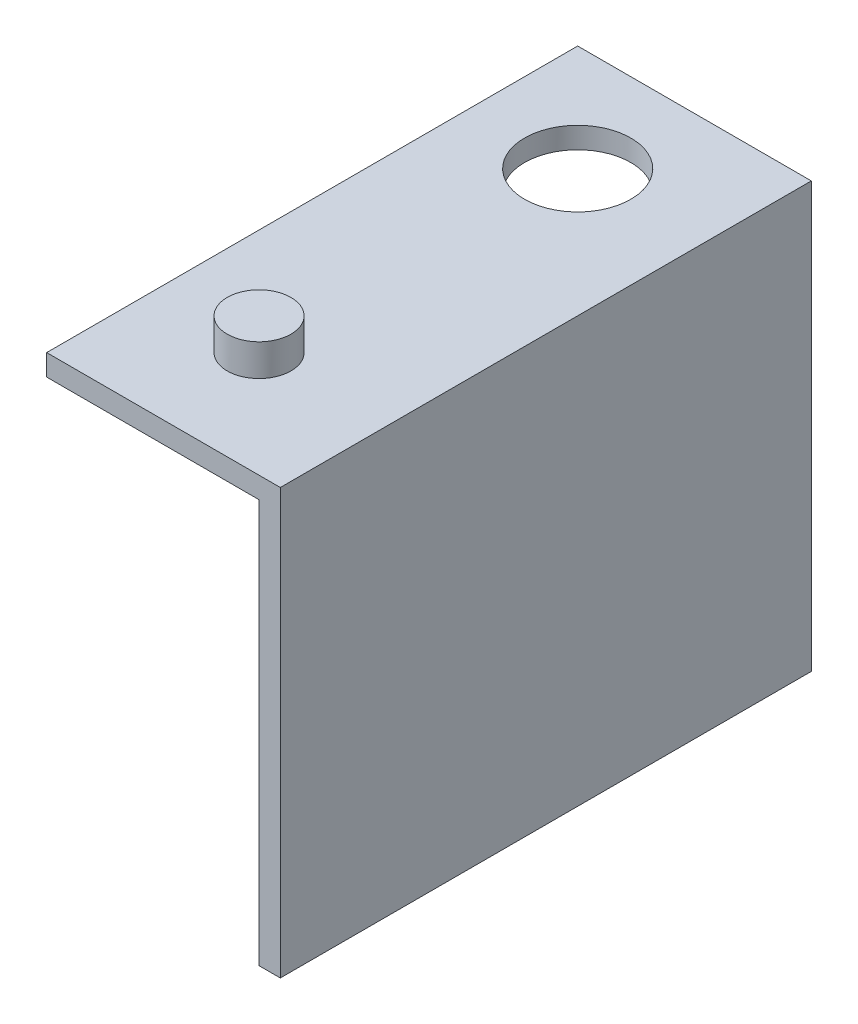
ISO-10303-21;
HEADER;
FILE_DESCRIPTION(('STEP AP214'),'2;1');
FILE_NAME('part.step','',(''),(''),'','','');
FILE_SCHEMA(('AUTOMOTIVE_DESIGN { 1 0 10303 214 1 1 1 1 }'));
ENDSEC;
DATA;
#1=APPLICATION_CONTEXT('core data for automotive mechanical design processes');
#2=APPLICATION_PROTOCOL_DEFINITION('international standard','automotive_design',2000,#1);
#3=PRODUCT_CONTEXT('',#1,'mechanical');
#4=PRODUCT('Part','Part','',(#3));
#5=PRODUCT_RELATED_PRODUCT_CATEGORY('part','',(#4));
#6=PRODUCT_DEFINITION_FORMATION('','',#4);
#7=PRODUCT_DEFINITION_CONTEXT('part definition',#1,'design');
#8=PRODUCT_DEFINITION('design','',#6,#7);
#9=PRODUCT_DEFINITION_SHAPE('','',#8);
#10=(LENGTH_UNIT() NAMED_UNIT(*) SI_UNIT(.MILLI.,.METRE.));
#11=(NAMED_UNIT(*) PLANE_ANGLE_UNIT() SI_UNIT($,.RADIAN.));
#12=(NAMED_UNIT(*) SI_UNIT($,.STERADIAN.) SOLID_ANGLE_UNIT());
#13=UNCERTAINTY_MEASURE_WITH_UNIT(LENGTH_MEASURE(1.E-05),#10,'distance_accuracy_value','');
#14=(GEOMETRIC_REPRESENTATION_CONTEXT(3) GLOBAL_UNCERTAINTY_ASSIGNED_CONTEXT((#13)) GLOBAL_UNIT_ASSIGNED_CONTEXT((#10,
#11,#12)) REPRESENTATION_CONTEXT('',''));
#15=CARTESIAN_POINT('',(0.,0.,0.));
#16=DIRECTION('',(0.,0.,1.));
#17=DIRECTION('',(1.,0.,0.));
#18=AXIS2_PLACEMENT_3D('',#15,#16,#17);
#19=CARTESIAN_POINT('',(20.,0.,50.));
#20=DIRECTION('',(0.,1.,0.));
#21=DIRECTION('',(-1.,0.,0.));
#22=AXIS2_PLACEMENT_3D('',#19,#20,#21);
#23=PLANE('',#22);
#24=CARTESIAN_POINT('',(10.,0.,10.));
#25=DIRECTION('',(0.,1.,0.));
#26=DIRECTION('',(-1.,0.,0.));
#27=AXIS2_PLACEMENT_3D('',#24,#25,#26);
#28=CIRCLE('',#27,5.);
#29=CARTESIAN_POINT('',(5.,0.,10.));
#30=VERTEX_POINT('',#29);
#31=EDGE_CURVE('E134',#30,#30,#28,.F.);
#32=ORIENTED_EDGE('',*,*,#31,.F.);
#33=EDGE_LOOP('',(#32));
#34=FACE_BOUND('',#33,.T.);
#35=DIRECTION('',(1.,0.,0.));
#36=VECTOR('',#35,1.);
#37=CARTESIAN_POINT('',(20.,0.,0.));
#38=LINE('',#37,#36);
#39=CARTESIAN_POINT('',(0.,0.,0.));
#40=VERTEX_POINT('',#39);
#41=CARTESIAN_POINT('',(20.,0.,0.));
#42=VERTEX_POINT('',#41);
#43=EDGE_CURVE('E129',#40,#42,#38,.T.);
#44=ORIENTED_EDGE('',*,*,#43,.T.);
#45=DIRECTION('',(0.,0.,-1.));
#46=VECTOR('',#45,1.);
#47=CARTESIAN_POINT('',(20.,0.,50.));
#48=LINE('',#47,#46);
#49=CARTESIAN_POINT('',(20.,0.,50.));
#50=VERTEX_POINT('',#49);
#51=EDGE_CURVE('E48',#50,#42,#48,.T.);
#52=ORIENTED_EDGE('',*,*,#51,.F.);
#53=DIRECTION('',(1.,0.,0.));
#54=VECTOR('',#53,1.);
#55=CARTESIAN_POINT('',(20.,0.,50.));
#56=LINE('',#55,#54);
#57=CARTESIAN_POINT('',(0.,0.,50.));
#58=VERTEX_POINT('',#57);
#59=EDGE_CURVE('E146',#58,#50,#56,.T.);
#60=ORIENTED_EDGE('',*,*,#59,.F.);
#61=DIRECTION('',(0.,0.,-1.));
#62=VECTOR('',#61,1.);
#63=CARTESIAN_POINT('',(0.,0.,50.));
#64=LINE('',#63,#62);
#65=EDGE_CURVE('E125',#58,#40,#64,.T.);
#66=ORIENTED_EDGE('',*,*,#65,.T.);
#67=EDGE_LOOP('',(#44,#52,#60,#66));
#68=FACE_BOUND('',#67,.T.);
#69=ADVANCED_FACE('F39',(#34,#68),#23,.F.);
#70=CARTESIAN_POINT('',(20.,-38.,50.));
#71=DIRECTION('',(1.,0.,0.));
#72=DIRECTION('',(0.,0.,-1.));
#73=AXIS2_PLACEMENT_3D('',#70,#71,#72);
#74=PLANE('',#73);
#75=DIRECTION('',(0.,-1.,0.));
#76=VECTOR('',#75,1.);
#77=CARTESIAN_POINT('',(20.,-38.,0.));
#78=LINE('',#77,#76);
#79=CARTESIAN_POINT('',(20.,-38.,0.));
#80=VERTEX_POINT('',#79);
#81=EDGE_CURVE('E133',#42,#80,#78,.T.);
#82=ORIENTED_EDGE('',*,*,#81,.T.);
#83=DIRECTION('',(0.,0.,-1.));
#84=VECTOR('',#83,1.);
#85=CARTESIAN_POINT('',(20.,-38.,50.));
#86=LINE('',#85,#84);
#87=CARTESIAN_POINT('',(20.,-38.,50.));
#88=VERTEX_POINT('',#87);
#89=EDGE_CURVE('E153',#88,#80,#86,.T.);
#90=ORIENTED_EDGE('',*,*,#89,.F.);
#91=DIRECTION('',(0.,-1.,0.));
#92=VECTOR('',#91,1.);
#93=CARTESIAN_POINT('',(20.,-38.,50.));
#94=LINE('',#93,#92);
#95=EDGE_CURVE('E94',#50,#88,#94,.T.);
#96=ORIENTED_EDGE('',*,*,#95,.F.);
#97=ORIENTED_EDGE('',*,*,#51,.T.);
#98=EDGE_LOOP('',(#82,#90,#96,#97));
#99=FACE_BOUND('',#98,.T.);
#100=ADVANCED_FACE('F158',(#99),#74,.F.);
#101=CARTESIAN_POINT('',(22.,-38.,50.));
#102=DIRECTION('',(0.,1.,0.));
#103=DIRECTION('',(-1.,0.,0.));
#104=AXIS2_PLACEMENT_3D('',#101,#102,#103);
#105=PLANE('',#104);
#106=DIRECTION('',(1.,0.,0.));
#107=VECTOR('',#106,1.);
#108=CARTESIAN_POINT('',(22.,-38.,0.));
#109=LINE('',#108,#107);
#110=CARTESIAN_POINT('',(22.,-38.,0.));
#111=VERTEX_POINT('',#110);
#112=EDGE_CURVE('E137',#80,#111,#109,.T.);
#113=ORIENTED_EDGE('',*,*,#112,.T.);
#114=DIRECTION('',(0.,0.,-1.));
#115=VECTOR('',#114,1.);
#116=CARTESIAN_POINT('',(22.,-38.,50.));
#117=LINE('',#116,#115);
#118=CARTESIAN_POINT('',(22.,-38.,50.));
#119=VERTEX_POINT('',#118);
#120=EDGE_CURVE('E118',#119,#111,#117,.T.);
#121=ORIENTED_EDGE('',*,*,#120,.F.);
#122=DIRECTION('',(1.,0.,0.));
#123=VECTOR('',#122,1.);
#124=CARTESIAN_POINT('',(22.,-38.,50.));
#125=LINE('',#124,#123);
#126=EDGE_CURVE('E107',#88,#119,#125,.T.);
#127=ORIENTED_EDGE('',*,*,#126,.F.);
#128=ORIENTED_EDGE('',*,*,#89,.T.);
#129=EDGE_LOOP('',(#113,#121,#127,#128));
#130=FACE_BOUND('',#129,.T.);
#131=ADVANCED_FACE('F166',(#130),#105,.F.);
#132=CARTESIAN_POINT('',(22.,2.,50.));
#133=DIRECTION('',(-1.,0.,0.));
#134=DIRECTION('',(0.,-1.,0.));
#135=AXIS2_PLACEMENT_3D('',#132,#133,#134);
#136=PLANE('',#135);
#137=DIRECTION('',(0.,1.,0.));
#138=VECTOR('',#137,1.);
#139=CARTESIAN_POINT('',(22.,2.,0.));
#140=LINE('',#139,#138);
#141=CARTESIAN_POINT('',(22.,2.,0.));
#142=VERTEX_POINT('',#141);
#143=EDGE_CURVE('E116',#111,#142,#140,.T.);
#144=ORIENTED_EDGE('',*,*,#143,.T.);
#145=DIRECTION('',(0.,0.,-1.));
#146=VECTOR('',#145,1.);
#147=CARTESIAN_POINT('',(22.,2.,50.));
#148=LINE('',#147,#146);
#149=CARTESIAN_POINT('',(22.,2.,50.));
#150=VERTEX_POINT('',#149);
#151=EDGE_CURVE('E113',#150,#142,#148,.T.);
#152=ORIENTED_EDGE('',*,*,#151,.F.);
#153=DIRECTION('',(0.,1.,0.));
#154=VECTOR('',#153,1.);
#155=CARTESIAN_POINT('',(22.,2.,50.));
#156=LINE('',#155,#154);
#157=EDGE_CURVE('E101',#119,#150,#156,.T.);
#158=ORIENTED_EDGE('',*,*,#157,.F.);
#159=ORIENTED_EDGE('',*,*,#120,.T.);
#160=EDGE_LOOP('',(#144,#152,#158,#159));
#161=FACE_BOUND('',#160,.T.);
#162=ADVANCED_FACE('F114',(#161),#136,.F.);
#163=CARTESIAN_POINT('',(0.,2.,50.));
#164=DIRECTION('',(0.,-1.,0.));
#165=DIRECTION('',(0.,0.,-1.));
#166=AXIS2_PLACEMENT_3D('',#163,#164,#165);
#167=PLANE('',#166);
#168=CARTESIAN_POINT('',(10.,2.,40.));
#169=DIRECTION('',(0.,-1.,0.));
#170=DIRECTION('',(0.,0.,-1.));
#171=AXIS2_PLACEMENT_3D('',#168,#169,#170);
#172=CIRCLE('',#171,3.);
#173=CARTESIAN_POINT('',(10.,2.,37.));
#174=VERTEX_POINT('',#173);
#175=EDGE_CURVE('E11',#174,#174,#172,.F.);
#176=ORIENTED_EDGE('',*,*,#175,.F.);
#177=EDGE_LOOP('',(#176));
#178=FACE_BOUND('',#177,.T.);
#179=CARTESIAN_POINT('',(10.,2.,10.));
#180=DIRECTION('',(0.,1.,0.));
#181=DIRECTION('',(0.,0.,1.));
#182=AXIS2_PLACEMENT_3D('',#179,#180,#181);
#183=CIRCLE('',#182,5.);
#184=CARTESIAN_POINT('',(10.,2.,15.));
#185=VERTEX_POINT('',#184);
#186=EDGE_CURVE('E176',#185,#185,#183,.T.);
#187=ORIENTED_EDGE('',*,*,#186,.F.);
#188=EDGE_LOOP('',(#187));
#189=FACE_BOUND('',#188,.T.);
#190=DIRECTION('',(-1.,0.,0.));
#191=VECTOR('',#190,1.);
#192=CARTESIAN_POINT('',(0.,2.,0.));
#193=LINE('',#192,#191);
#194=CARTESIAN_POINT('',(0.,2.,0.));
#195=VERTEX_POINT('',#194);
#196=EDGE_CURVE('E79',#142,#195,#193,.T.);
#197=ORIENTED_EDGE('',*,*,#196,.T.);
#198=DIRECTION('',(0.,0.,-1.));
#199=VECTOR('',#198,1.);
#200=CARTESIAN_POINT('',(0.,2.,50.));
#201=LINE('',#200,#199);
#202=CARTESIAN_POINT('',(0.,2.,50.));
#203=VERTEX_POINT('',#202);
#204=EDGE_CURVE('E119',#203,#195,#201,.T.);
#205=ORIENTED_EDGE('',*,*,#204,.F.);
#206=DIRECTION('',(-1.,0.,0.));
#207=VECTOR('',#206,1.);
#208=CARTESIAN_POINT('',(0.,2.,50.));
#209=LINE('',#208,#207);
#210=EDGE_CURVE('E105',#150,#203,#209,.T.);
#211=ORIENTED_EDGE('',*,*,#210,.F.);
#212=ORIENTED_EDGE('',*,*,#151,.T.);
#213=EDGE_LOOP('',(#197,#205,#211,#212));
#214=FACE_BOUND('',#213,.T.);
#215=ADVANCED_FACE('F121',(#178,#189,#214),#167,.F.);
#216=CARTESIAN_POINT('',(0.,0.,50.));
#217=DIRECTION('',(1.,0.,0.));
#218=DIRECTION('',(0.,0.,-1.));
#219=AXIS2_PLACEMENT_3D('',#216,#217,#218);
#220=PLANE('',#219);
#221=DIRECTION('',(0.,-1.,0.));
#222=VECTOR('',#221,1.);
#223=CARTESIAN_POINT('',(0.,0.,0.));
#224=LINE('',#223,#222);
#225=EDGE_CURVE('E85',#195,#40,#224,.T.);
#226=ORIENTED_EDGE('',*,*,#225,.T.);
#227=ORIENTED_EDGE('',*,*,#65,.F.);
#228=DIRECTION('',(0.,-1.,0.));
#229=VECTOR('',#228,1.);
#230=CARTESIAN_POINT('',(0.,0.,50.));
#231=LINE('',#230,#229);
#232=EDGE_CURVE('E56',#203,#58,#231,.T.);
#233=ORIENTED_EDGE('',*,*,#232,.F.);
#234=ORIENTED_EDGE('',*,*,#204,.T.);
#235=EDGE_LOOP('',(#226,#227,#233,#234));
#236=FACE_BOUND('',#235,.T.);
#237=ADVANCED_FACE('F196',(#236),#220,.F.);
#238=CARTESIAN_POINT('',(0.,0.,50.));
#239=DIRECTION('',(0.,0.,-1.));
#240=DIRECTION('',(-1.,0.,0.));
#241=AXIS2_PLACEMENT_3D('',#238,#239,#240);
#242=PLANE('',#241);
#243=ORIENTED_EDGE('',*,*,#59,.T.);
#244=ORIENTED_EDGE('',*,*,#95,.T.);
#245=ORIENTED_EDGE('',*,*,#126,.T.);
#246=ORIENTED_EDGE('',*,*,#157,.T.);
#247=ORIENTED_EDGE('',*,*,#210,.T.);
#248=ORIENTED_EDGE('',*,*,#232,.T.);
#249=EDGE_LOOP('',(#243,#244,#245,#246,#247,#248));
#250=FACE_BOUND('',#249,.T.);
#251=ADVANCED_FACE('F103',(#250),#242,.F.);
#252=CARTESIAN_POINT('',(0.,0.,0.));
#253=DIRECTION('',(0.,0.,-1.));
#254=DIRECTION('',(-1.,0.,0.));
#255=AXIS2_PLACEMENT_3D('',#252,#253,#254);
#256=PLANE('',#255);
#257=ORIENTED_EDGE('',*,*,#43,.F.);
#258=ORIENTED_EDGE('',*,*,#225,.F.);
#259=ORIENTED_EDGE('',*,*,#196,.F.);
#260=ORIENTED_EDGE('',*,*,#143,.F.);
#261=ORIENTED_EDGE('',*,*,#112,.F.);
#262=ORIENTED_EDGE('',*,*,#81,.F.);
#263=EDGE_LOOP('',(#257,#258,#259,#260,#261,#262));
#264=FACE_BOUND('',#263,.T.);
#265=ADVANCED_FACE('F163',(#264),#256,.T.);
#266=CARTESIAN_POINT('',(10.,-38.001,10.));
#267=DIRECTION('',(0.,1.,0.));
#268=DIRECTION('',(0.,0.,1.));
#269=AXIS2_PLACEMENT_3D('',#266,#267,#268);
#270=CYLINDRICAL_SURFACE('',#269,5.);
#271=ORIENTED_EDGE('',*,*,#186,.T.);
#272=EDGE_LOOP('',(#271));
#273=FACE_BOUND('',#272,.T.);
#274=ORIENTED_EDGE('',*,*,#31,.T.);
#275=EDGE_LOOP('',(#274));
#276=FACE_BOUND('',#275,.T.);
#277=ADVANCED_FACE('F190',(#273,#276),#270,.F.);
#278=CARTESIAN_POINT('',(10.,5.,40.));
#279=DIRECTION('',(0.,-1.,0.));
#280=DIRECTION('',(0.,0.,-1.));
#281=AXIS2_PLACEMENT_3D('',#278,#279,#280);
#282=CYLINDRICAL_SURFACE('',#281,3.);
#283=CARTESIAN_POINT('',(10.,5.,40.));
#284=DIRECTION('',(0.,1.,0.));
#285=DIRECTION('',(0.,0.,1.));
#286=AXIS2_PLACEMENT_3D('',#283,#284,#285);
#287=CIRCLE('',#286,3.);
#288=CARTESIAN_POINT('',(10.,5.,43.));
#289=VERTEX_POINT('',#288);
#290=EDGE_CURVE('E180',#289,#289,#287,.T.);
#291=ORIENTED_EDGE('',*,*,#290,.F.);
#292=EDGE_LOOP('',(#291));
#293=FACE_BOUND('',#292,.T.);
#294=ORIENTED_EDGE('',*,*,#175,.T.);
#295=EDGE_LOOP('',(#294));
#296=FACE_BOUND('',#295,.T.);
#297=ADVANCED_FACE('F187',(#293,#296),#282,.T.);
#298=CARTESIAN_POINT('',(10.,5.,40.));
#299=DIRECTION('',(0.,1.,0.));
#300=DIRECTION('',(0.,0.,1.));
#301=AXIS2_PLACEMENT_3D('',#298,#299,#300);
#302=PLANE('',#301);
#303=ORIENTED_EDGE('',*,*,#290,.T.);
#304=EDGE_LOOP('',(#303));
#305=FACE_BOUND('',#304,.T.);
#306=ADVANCED_FACE('F185',(#305),#302,.T.);
#307=CLOSED_SHELL('',(#69,#100,#131,#162,#215,#237,#251,#265,#277,#297,#306));
#308=MANIFOLD_SOLID_BREP('B2',#307);
#309=ADVANCED_BREP_SHAPE_REPRESENTATION('',(#18,#308),#14);
#310=SHAPE_DEFINITION_REPRESENTATION(#9,#309);
ENDSEC;
END-ISO-10303-21;
